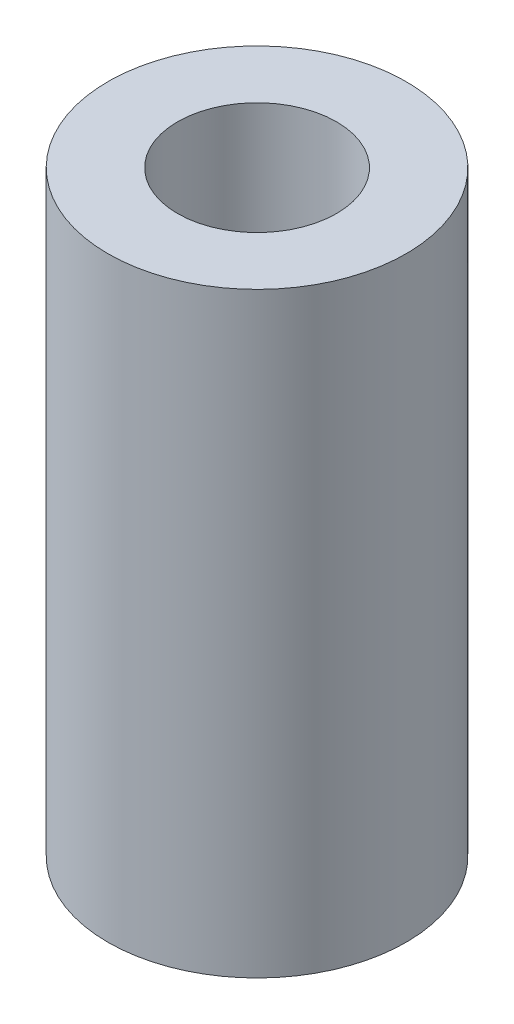
ISO-10303-21;
HEADER;
FILE_DESCRIPTION(('STEP AP214'),'2;1');
FILE_NAME('part.step','',(''),(''),'','','');
FILE_SCHEMA(('AUTOMOTIVE_DESIGN { 1 0 10303 214 1 1 1 1 }'));
ENDSEC;
DATA;
#1=APPLICATION_CONTEXT('core data for automotive mechanical design processes');
#2=APPLICATION_PROTOCOL_DEFINITION('international standard','automotive_design',2000,#1);
#3=PRODUCT_CONTEXT('',#1,'mechanical');
#4=PRODUCT('Part','Part','',(#3));
#5=PRODUCT_RELATED_PRODUCT_CATEGORY('part','',(#4));
#6=PRODUCT_DEFINITION_FORMATION('','',#4);
#7=PRODUCT_DEFINITION_CONTEXT('part definition',#1,'design');
#8=PRODUCT_DEFINITION('design','',#6,#7);
#9=PRODUCT_DEFINITION_SHAPE('','',#8);
#10=(LENGTH_UNIT() NAMED_UNIT(*) SI_UNIT(.MILLI.,.METRE.));
#11=(NAMED_UNIT(*) PLANE_ANGLE_UNIT() SI_UNIT($,.RADIAN.));
#12=(NAMED_UNIT(*) SI_UNIT($,.STERADIAN.) SOLID_ANGLE_UNIT());
#13=UNCERTAINTY_MEASURE_WITH_UNIT(LENGTH_MEASURE(1.E-05),#10,'distance_accuracy_value','');
#14=(GEOMETRIC_REPRESENTATION_CONTEXT(3) GLOBAL_UNCERTAINTY_ASSIGNED_CONTEXT((#13)) GLOBAL_UNIT_ASSIGNED_CONTEXT((#10,
#11,#12)) REPRESENTATION_CONTEXT('',''));
#15=CARTESIAN_POINT('',(0.,0.,0.));
#16=DIRECTION('',(0.,0.,1.));
#17=DIRECTION('',(1.,0.,0.));
#18=AXIS2_PLACEMENT_3D('',#15,#16,#17);
#19=CARTESIAN_POINT('',(0.,30.,0.));
#20=DIRECTION('',(0.,1.,0.));
#21=DIRECTION('',(0.,0.,1.));
#22=AXIS2_PLACEMENT_3D('',#19,#20,#21);
#23=PLANE('',#22);
#24=CARTESIAN_POINT('',(0.,30.,0.));
#25=DIRECTION('',(0.,1.,0.));
#26=DIRECTION('',(0.,0.,1.));
#27=AXIS2_PLACEMENT_3D('',#24,#25,#26);
#28=CIRCLE('',#27,15.);
#29=CARTESIAN_POINT('',(0.,30.,15.));
#30=VERTEX_POINT('',#29);
#31=EDGE_CURVE('E10',#30,#30,#28,.T.);
#32=ORIENTED_EDGE('',*,*,#31,.T.);
#33=EDGE_LOOP('',(#32));
#34=FACE_BOUND('',#33,.T.);
#35=CARTESIAN_POINT('',(0.,30.,0.));
#36=DIRECTION('',(0.,1.,0.));
#37=DIRECTION('',(0.,0.,1.));
#38=AXIS2_PLACEMENT_3D('',#35,#36,#37);
#39=CIRCLE('',#38,8.);
#40=CARTESIAN_POINT('',(0.,30.,8.));
#41=VERTEX_POINT('',#40);
#42=EDGE_CURVE('E48',#41,#41,#39,.T.);
#43=ORIENTED_EDGE('',*,*,#42,.F.);
#44=EDGE_LOOP('',(#43));
#45=FACE_BOUND('',#44,.T.);
#46=ADVANCED_FACE('F37',(#34,#45),#23,.T.);
#47=CARTESIAN_POINT('',(0.,-30.,0.));
#48=DIRECTION('',(0.,1.,0.));
#49=DIRECTION('',(0.,0.,1.));
#50=AXIS2_PLACEMENT_3D('',#47,#48,#49);
#51=PLANE('',#50);
#52=CARTESIAN_POINT('',(0.,-30.,0.));
#53=DIRECTION('',(0.,1.,0.));
#54=DIRECTION('',(0.,0.,1.));
#55=AXIS2_PLACEMENT_3D('',#52,#53,#54);
#56=CIRCLE('',#55,15.);
#57=CARTESIAN_POINT('',(0.,-30.,15.));
#58=VERTEX_POINT('',#57);
#59=EDGE_CURVE('E41',#58,#58,#56,.T.);
#60=ORIENTED_EDGE('',*,*,#59,.F.);
#61=EDGE_LOOP('',(#60));
#62=FACE_BOUND('',#61,.T.);
#63=CARTESIAN_POINT('',(0.,-30.,0.));
#64=DIRECTION('',(0.,1.,0.));
#65=DIRECTION('',(0.,0.,1.));
#66=AXIS2_PLACEMENT_3D('',#63,#64,#65);
#67=CIRCLE('',#66,8.);
#68=CARTESIAN_POINT('',(0.,-30.,8.));
#69=VERTEX_POINT('',#68);
#70=EDGE_CURVE('E50',#69,#69,#67,.T.);
#71=ORIENTED_EDGE('',*,*,#70,.T.);
#72=EDGE_LOOP('',(#71));
#73=FACE_BOUND('',#72,.T.);
#74=ADVANCED_FACE('F60',(#62,#73),#51,.F.);
#75=CARTESIAN_POINT('',(0.,30.,0.));
#76=DIRECTION('',(0.,-1.,0.));
#77=DIRECTION('',(0.,0.,-1.));
#78=AXIS2_PLACEMENT_3D('',#75,#76,#77);
#79=CYLINDRICAL_SURFACE('',#78,15.);
#80=ORIENTED_EDGE('',*,*,#31,.F.);
#81=EDGE_LOOP('',(#80));
#82=FACE_BOUND('',#81,.T.);
#83=ORIENTED_EDGE('',*,*,#59,.T.);
#84=EDGE_LOOP('',(#83));
#85=FACE_BOUND('',#84,.T.);
#86=ADVANCED_FACE('F39',(#82,#85),#79,.T.);
#87=CARTESIAN_POINT('',(0.,30.,0.));
#88=DIRECTION('',(0.,-1.,0.));
#89=DIRECTION('',(0.,0.,-1.));
#90=AXIS2_PLACEMENT_3D('',#87,#88,#89);
#91=CYLINDRICAL_SURFACE('',#90,8.);
#92=ORIENTED_EDGE('',*,*,#42,.T.);
#93=EDGE_LOOP('',(#92));
#94=FACE_BOUND('',#93,.T.);
#95=ORIENTED_EDGE('',*,*,#70,.F.);
#96=EDGE_LOOP('',(#95));
#97=FACE_BOUND('',#96,.T.);
#98=ADVANCED_FACE('F56',(#94,#97),#91,.F.);
#99=CLOSED_SHELL('',(#46,#74,#86,#98));
#100=MANIFOLD_SOLID_BREP('B2',#99);
#101=ADVANCED_BREP_SHAPE_REPRESENTATION('',(#18,#100),#14);
#102=SHAPE_DEFINITION_REPRESENTATION(#9,#101);
ENDSEC;
END-ISO-10303-21;
